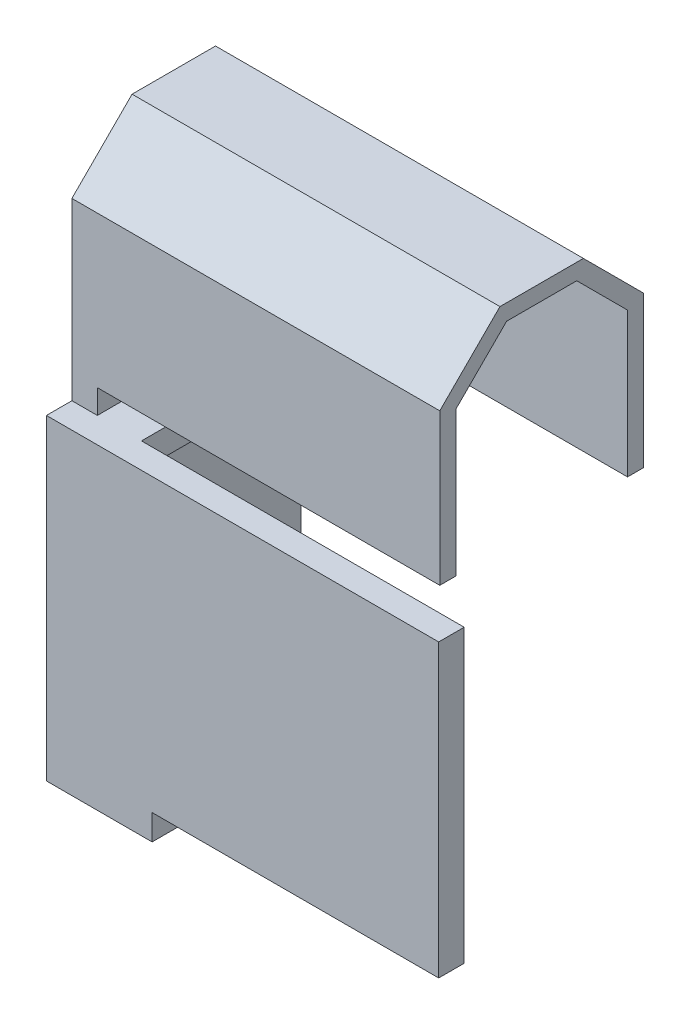
ISO-10303-21;
HEADER;
FILE_DESCRIPTION(('STEP AP214'),'2;1');
FILE_NAME('part.step','',(''),(''),'','','');
FILE_SCHEMA(('AUTOMOTIVE_DESIGN { 1 0 10303 214 1 1 1 1 }'));
ENDSEC;
DATA;
#1=APPLICATION_CONTEXT('core data for automotive mechanical design processes');
#2=APPLICATION_PROTOCOL_DEFINITION('international standard','automotive_design',2000,#1);
#3=PRODUCT_CONTEXT('',#1,'mechanical');
#4=PRODUCT('Part','Part','',(#3));
#5=PRODUCT_RELATED_PRODUCT_CATEGORY('part','',(#4));
#6=PRODUCT_DEFINITION_FORMATION('','',#4);
#7=PRODUCT_DEFINITION_CONTEXT('part definition',#1,'design');
#8=PRODUCT_DEFINITION('design','',#6,#7);
#9=PRODUCT_DEFINITION_SHAPE('','',#8);
#10=(LENGTH_UNIT() NAMED_UNIT(*) SI_UNIT(.MILLI.,.METRE.));
#11=(NAMED_UNIT(*) PLANE_ANGLE_UNIT() SI_UNIT($,.RADIAN.));
#12=(NAMED_UNIT(*) SI_UNIT($,.STERADIAN.) SOLID_ANGLE_UNIT());
#13=UNCERTAINTY_MEASURE_WITH_UNIT(LENGTH_MEASURE(1.E-05),#10,'distance_accuracy_value','');
#14=(GEOMETRIC_REPRESENTATION_CONTEXT(3) GLOBAL_UNCERTAINTY_ASSIGNED_CONTEXT((#13)) GLOBAL_UNIT_ASSIGNED_CONTEXT((#10,
#11,#12)) REPRESENTATION_CONTEXT('',''));
#15=CARTESIAN_POINT('',(0.,0.,0.));
#16=DIRECTION('',(0.,0.,1.));
#17=DIRECTION('',(1.,0.,0.));
#18=AXIS2_PLACEMENT_3D('',#15,#16,#17);
#19=CARTESIAN_POINT('',(3.175,0.,0.));
#20=DIRECTION('',(1.,0.,0.));
#21=DIRECTION('',(0.,0.,-1.));
#22=AXIS2_PLACEMENT_3D('',#19,#20,#21);
#23=PLANE('',#22);
#24=CARTESIAN_POINT('',(3.175,0.,0.));
#25=DIRECTION('',(1.,0.,0.));
#26=DIRECTION('',(0.,0.,-1.));
#27=AXIS2_PLACEMENT_3D('',#24,#25,#26);
#28=CIRCLE('',#27,5.);
#29=CARTESIAN_POINT('',(3.175,0.,-5.));
#30=VERTEX_POINT('',#29);
#31=EDGE_CURVE('E385',#30,#30,#28,.T.);
#32=ORIENTED_EDGE('',*,*,#31,.F.);
#33=EDGE_LOOP('',(#32));
#34=FACE_BOUND('',#33,.T.);
#35=DIRECTION('',(0.,0.707106781186546,-0.707106781186549));
#36=VECTOR('',#35,1.);
#37=CARTESIAN_POINT('',(3.175,10.7,4.37157287525378));
#38=LINE('',#37,#36);
#39=CARTESIAN_POINT('',(3.175,4.37157287525381,10.7));
#40=VERTEX_POINT('',#39);
#41=CARTESIAN_POINT('',(3.175,10.7,4.37157287525378));
#42=VERTEX_POINT('',#41);
#43=EDGE_CURVE('E61',#40,#42,#38,.T.);
#44=ORIENTED_EDGE('',*,*,#43,.F.);
#45=DIRECTION('',(0.,1.,0.));
#46=VECTOR('',#45,1.);
#47=CARTESIAN_POINT('',(3.175,4.37157287525381,10.7));
#48=LINE('',#47,#46);
#49=CARTESIAN_POINT('',(3.175,-13.6385215511798,10.7));
#50=VERTEX_POINT('',#49);
#51=EDGE_CURVE('E289',#50,#40,#48,.T.);
#52=ORIENTED_EDGE('',*,*,#51,.F.);
#53=DIRECTION('',(0.,0.,1.));
#54=VECTOR('',#53,1.);
#55=CARTESIAN_POINT('',(3.175,-13.6385215511798,0.));
#56=LINE('',#55,#54);
#57=CARTESIAN_POINT('',(3.175,-13.6385215511798,-10.7));
#58=VERTEX_POINT('',#57);
#59=EDGE_CURVE('E439',#58,#50,#56,.T.);
#60=ORIENTED_EDGE('',*,*,#59,.F.);
#61=DIRECTION('',(0.,-1.,0.));
#62=VECTOR('',#61,1.);
#63=CARTESIAN_POINT('',(3.175,-11.6385215511798,-10.7));
#64=LINE('',#63,#62);
#65=CARTESIAN_POINT('',(3.175,4.37157287525378,-10.7));
#66=VERTEX_POINT('',#65);
#67=EDGE_CURVE('E294',#66,#58,#64,.T.);
#68=ORIENTED_EDGE('',*,*,#67,.F.);
#69=DIRECTION('',(0.,-0.707106781186549,-0.707106781186546));
#70=VECTOR('',#69,1.);
#71=CARTESIAN_POINT('',(3.175,4.37157287525378,-10.7));
#72=LINE('',#71,#70);
#73=CARTESIAN_POINT('',(3.175,10.7,-4.37157287525381));
#74=VERTEX_POINT('',#73);
#75=EDGE_CURVE('E325',#74,#66,#72,.T.);
#76=ORIENTED_EDGE('',*,*,#75,.F.);
#77=DIRECTION('',(0.,0.,-1.));
#78=VECTOR('',#77,1.);
#79=CARTESIAN_POINT('',(3.175,10.7,-4.37157287525381));
#80=LINE('',#79,#78);
#81=EDGE_CURVE('E66',#42,#74,#80,.T.);
#82=ORIENTED_EDGE('',*,*,#81,.F.);
#83=EDGE_LOOP('',(#44,#52,#60,#68,#76,#82));
#84=FACE_BOUND('',#83,.T.);
#85=ADVANCED_FACE('F43',(#34,#84),#23,.T.);
#86=CARTESIAN_POINT('',(-8.5030184216995,-56.0885215511798,-12.7));
#87=DIRECTION('',(-1.,0.,0.));
#88=DIRECTION('',(0.,0.,1.));
#89=AXIS2_PLACEMENT_3D('',#86,#87,#88);
#90=PLANE('',#89);
#91=DIRECTION('',(0.,0.,1.));
#92=VECTOR('',#91,1.);
#93=CARTESIAN_POINT('',(-8.5030184216995,-52.9135215511798,12.7));
#94=LINE('',#93,#92);
#95=CARTESIAN_POINT('',(-8.5030184216995,-52.9135215511798,-12.7));
#96=VERTEX_POINT('',#95);
#97=CARTESIAN_POINT('',(-8.5030184216995,-52.9135215511798,12.7));
#98=VERTEX_POINT('',#97);
#99=EDGE_CURVE('E347',#96,#98,#94,.T.);
#100=ORIENTED_EDGE('',*,*,#99,.F.);
#101=DIRECTION('',(0.,1.,0.));
#102=VECTOR('',#101,1.);
#103=CARTESIAN_POINT('',(-8.5030184216995,-56.0885215511798,-12.7));
#104=LINE('',#103,#102);
#105=CARTESIAN_POINT('',(-8.5030184216995,-19.8135215511798,-12.7));
#106=VERTEX_POINT('',#105);
#107=EDGE_CURVE('E399',#96,#106,#104,.T.);
#108=ORIENTED_EDGE('',*,*,#107,.T.);
#109=DIRECTION('',(0.,0.,-1.));
#110=VECTOR('',#109,1.);
#111=CARTESIAN_POINT('',(-8.5030184216995,-19.8135215511798,12.7));
#112=LINE('',#111,#110);
#113=CARTESIAN_POINT('',(-8.5030184216995,-19.8135215511798,12.7));
#114=VERTEX_POINT('',#113);
#115=EDGE_CURVE('E363',#114,#106,#112,.T.);
#116=ORIENTED_EDGE('',*,*,#115,.F.);
#117=DIRECTION('',(0.,1.,0.));
#118=VECTOR('',#117,1.);
#119=CARTESIAN_POINT('',(-8.5030184216995,-56.0885215511798,12.7));
#120=LINE('',#119,#118);
#121=EDGE_CURVE('E395',#98,#114,#120,.T.);
#122=ORIENTED_EDGE('',*,*,#121,.F.);
#123=EDGE_LOOP('',(#100,#108,#116,#122));
#124=FACE_BOUND('',#123,.T.);
#125=ADVANCED_FACE('F526',(#124),#90,.F.);
#126=DIRECTION('',(0.,0.,1.));
#127=VECTOR('',#126,1.);
#128=CARTESIAN_POINT('',(-8.5030184216995,-16.6385215511798,12.7));
#129=LINE('',#128,#127);
#130=CARTESIAN_POINT('',(-8.5030184216995,-16.6385215511798,-12.7));
#131=VERTEX_POINT('',#130);
#132=CARTESIAN_POINT('',(-8.5030184216995,-16.6385215511798,12.7));
#133=VERTEX_POINT('',#132);
#134=EDGE_CURVE('E359',#131,#133,#129,.T.);
#135=ORIENTED_EDGE('',*,*,#134,.F.);
#136=CARTESIAN_POINT('',(-8.5030184216995,-13.6385215511798,-12.7));
#137=VERTEX_POINT('',#136);
#138=EDGE_CURVE('E398',#131,#137,#104,.T.);
#139=ORIENTED_EDGE('',*,*,#138,.T.);
#140=DIRECTION('',(0.,0.,1.));
#141=VECTOR('',#140,1.);
#142=CARTESIAN_POINT('',(-8.5030184216995,-13.6385215511798,-12.7));
#143=LINE('',#142,#141);
#144=CARTESIAN_POINT('',(-8.5030184216995,-13.6385215511798,12.7));
#145=VERTEX_POINT('',#144);
#146=EDGE_CURVE('E250',#137,#145,#143,.T.);
#147=ORIENTED_EDGE('',*,*,#146,.T.);
#148=EDGE_CURVE('E392',#133,#145,#120,.T.);
#149=ORIENTED_EDGE('',*,*,#148,.F.);
#150=EDGE_LOOP('',(#135,#139,#147,#149));
#151=FACE_BOUND('',#150,.T.);
#152=ADVANCED_FACE('F532',(#151),#90,.F.);
#153=CARTESIAN_POINT('',(0.,0.,0.));
#154=DIRECTION('',(1.,0.,0.));
#155=DIRECTION('',(0.,0.,-1.));
#156=AXIS2_PLACEMENT_3D('',#153,#154,#155);
#157=PLANE('',#156);
#158=CARTESIAN_POINT('',(0.,0.,0.));
#159=DIRECTION('',(1.,0.,0.));
#160=DIRECTION('',(0.,0.,-1.));
#161=AXIS2_PLACEMENT_3D('',#158,#159,#160);
#162=CIRCLE('',#161,3.);
#163=CARTESIAN_POINT('',(0.,0.,-3.));
#164=VERTEX_POINT('',#163);
#165=EDGE_CURVE('E438',#164,#164,#162,.T.);
#166=ORIENTED_EDGE('',*,*,#165,.T.);
#167=EDGE_LOOP('',(#166));
#168=FACE_BOUND('',#167,.T.);
#169=DIRECTION('',(0.,-1.,0.));
#170=VECTOR('',#169,1.);
#171=CARTESIAN_POINT('',(0.,-11.6385215511798,10.7));
#172=LINE('',#171,#170);
#173=CARTESIAN_POINT('',(0.,3.19999999999994,10.7));
#174=VERTEX_POINT('',#173);
#175=CARTESIAN_POINT('',(0.,-13.6385215511798,10.7));
#176=VERTEX_POINT('',#175);
#177=EDGE_CURVE('E421',#174,#176,#172,.T.);
#178=ORIENTED_EDGE('',*,*,#177,.F.);
#179=DIRECTION('',(0.,-0.707106781186551,0.707106781186544));
#180=VECTOR('',#179,1.);
#181=CARTESIAN_POINT('',(0.,3.19999999999994,10.7));
#182=LINE('',#181,#180);
#183=CARTESIAN_POINT('',(0.,10.7,3.20000000000003));
#184=VERTEX_POINT('',#183);
#185=EDGE_CURVE('E472',#174,#184,#182,.F.);
#186=ORIENTED_EDGE('',*,*,#185,.T.);
#187=DIRECTION('',(0.,0.,1.));
#188=VECTOR('',#187,1.);
#189=CARTESIAN_POINT('',(0.,10.7,10.7));
#190=LINE('',#189,#188);
#191=CARTESIAN_POINT('',(0.,10.7,-3.19999999999994));
#192=VERTEX_POINT('',#191);
#193=EDGE_CURVE('E429',#192,#184,#190,.T.);
#194=ORIENTED_EDGE('',*,*,#193,.F.);
#195=DIRECTION('',(0.,0.707106781186544,0.707106781186551));
#196=VECTOR('',#195,1.);
#197=CARTESIAN_POINT('',(0.,10.7,-3.19999999999994));
#198=LINE('',#197,#196);
#199=CARTESIAN_POINT('',(0.,3.20000000000003,-10.7));
#200=VERTEX_POINT('',#199);
#201=EDGE_CURVE('E470',#192,#200,#198,.F.);
#202=ORIENTED_EDGE('',*,*,#201,.T.);
#203=DIRECTION('',(0.,1.,0.));
#204=VECTOR('',#203,1.);
#205=CARTESIAN_POINT('',(0.,10.7,-10.7));
#206=LINE('',#205,#204);
#207=CARTESIAN_POINT('',(0.,-13.6385215511798,-10.7));
#208=VERTEX_POINT('',#207);
#209=EDGE_CURVE('E414',#208,#200,#206,.T.);
#210=ORIENTED_EDGE('',*,*,#209,.F.);
#211=DIRECTION('',(0.,0.,1.));
#212=VECTOR('',#211,1.);
#213=CARTESIAN_POINT('',(0.,-13.6385215511798,0.));
#214=LINE('',#213,#212);
#215=EDGE_CURVE('E443',#208,#176,#214,.T.);
#216=ORIENTED_EDGE('',*,*,#215,.T.);
#217=EDGE_LOOP('',(#178,#186,#194,#202,#210,#216));
#218=FACE_BOUND('',#217,.T.);
#219=ADVANCED_FACE('F500',(#168,#218),#157,.F.);
#220=CARTESIAN_POINT('',(3.175,0.,-12.7));
#221=DIRECTION('',(0.,0.,-1.));
#222=DIRECTION('',(-1.,0.,0.));
#223=AXIS2_PLACEMENT_3D('',#220,#221,#222);
#224=PLANE('',#223);
#225=DIRECTION('',(0.,-1.,0.));
#226=VECTOR('',#225,1.);
#227=CARTESIAN_POINT('',(-11.675,12.7,-12.7));
#228=LINE('',#227,#226);
#229=CARTESIAN_POINT('',(-11.675,5.19999999999997,-12.7));
#230=VERTEX_POINT('',#229);
#231=CARTESIAN_POINT('',(-11.675,-56.0885215511798,-12.7));
#232=VERTEX_POINT('',#231);
#233=EDGE_CURVE('E245',#230,#232,#228,.T.);
#234=ORIENTED_EDGE('',*,*,#233,.F.);
#235=DIRECTION('',(1.,0.,0.));
#236=VECTOR('',#235,1.);
#237=CARTESIAN_POINT('',(3.175,5.19999999999997,-12.7));
#238=LINE('',#237,#236);
#239=CARTESIAN_POINT('',(34.175,5.19999999999997,-12.7));
#240=VERTEX_POINT('',#239);
#241=EDGE_CURVE('E465',#230,#240,#238,.T.);
#242=ORIENTED_EDGE('',*,*,#241,.T.);
#243=DIRECTION('',(0.,1.,0.));
#244=VECTOR('',#243,1.);
#245=CARTESIAN_POINT('',(34.175,-13.6385215511798,-12.7));
#246=LINE('',#245,#244);
#247=CARTESIAN_POINT('',(34.175,-13.6385215511798,-12.7));
#248=VERTEX_POINT('',#247);
#249=EDGE_CURVE('E318',#248,#240,#246,.T.);
#250=ORIENTED_EDGE('',*,*,#249,.F.);
#251=DIRECTION('',(-1.,0.,0.));
#252=VECTOR('',#251,1.);
#253=CARTESIAN_POINT('',(3.175,-13.6385215511798,-12.7));
#254=LINE('',#253,#252);
#255=EDGE_CURVE('E442',#248,#137,#254,.T.);
#256=ORIENTED_EDGE('',*,*,#255,.T.);
#257=ORIENTED_EDGE('',*,*,#138,.F.);
#258=DIRECTION('',(-1.,0.,0.));
#259=VECTOR('',#258,1.);
#260=CARTESIAN_POINT('',(-3.0030184216995,-16.6385215511798,-12.7));
#261=LINE('',#260,#259);
#262=CARTESIAN_POINT('',(-3.0030184216995,-16.6385215511798,-12.7));
#263=VERTEX_POINT('',#262);
#264=EDGE_CURVE('E369',#263,#131,#261,.T.);
#265=ORIENTED_EDGE('',*,*,#264,.F.);
#266=DIRECTION('',(0.,1.,0.));
#267=VECTOR('',#266,1.);
#268=CARTESIAN_POINT('',(-3.0030184216995,-19.8135215511798,-12.7));
#269=LINE('',#268,#267);
#270=CARTESIAN_POINT('',(-3.0030184216995,-19.8135215511798,-12.7));
#271=VERTEX_POINT('',#270);
#272=EDGE_CURVE('E367',#271,#263,#269,.T.);
#273=ORIENTED_EDGE('',*,*,#272,.F.);
#274=DIRECTION('',(-1.,0.,0.));
#275=VECTOR('',#274,1.);
#276=CARTESIAN_POINT('',(-3.0030184216995,-19.8135215511798,-12.7));
#277=LINE('',#276,#275);
#278=EDGE_CURVE('E376',#271,#106,#277,.T.);
#279=ORIENTED_EDGE('',*,*,#278,.T.);
#280=ORIENTED_EDGE('',*,*,#107,.F.);
#281=DIRECTION('',(-1.,0.,0.));
#282=VECTOR('',#281,1.);
#283=CARTESIAN_POINT('',(1.4969815783005,-52.9135215511798,-12.7));
#284=LINE('',#283,#282);
#285=CARTESIAN_POINT('',(1.4969815783005,-52.9135215511798,-12.7));
#286=VERTEX_POINT('',#285);
#287=EDGE_CURVE('E357',#286,#96,#284,.T.);
#288=ORIENTED_EDGE('',*,*,#287,.F.);
#289=DIRECTION('',(0.,1.,0.));
#290=VECTOR('',#289,1.);
#291=CARTESIAN_POINT('',(1.4969815783005,-56.0885215511798,-12.7));
#292=LINE('',#291,#290);
#293=CARTESIAN_POINT('',(1.4969815783005,-56.0885215511798,-12.7));
#294=VERTEX_POINT('',#293);
#295=EDGE_CURVE('E349',#294,#286,#292,.T.);
#296=ORIENTED_EDGE('',*,*,#295,.F.);
#297=DIRECTION('',(1.,0.,0.));
#298=VECTOR('',#297,1.);
#299=CARTESIAN_POINT('',(-11.675,-56.0885215511798,-12.7));
#300=LINE('',#299,#298);
#301=EDGE_CURVE('E249',#232,#294,#300,.T.);
#302=ORIENTED_EDGE('',*,*,#301,.F.);
#303=EDGE_LOOP('',(#234,#242,#250,#256,#257,#265,#273,#279,#280,#288,#296,#302));
#304=FACE_BOUND('',#303,.T.);
#305=ADVANCED_FACE('F538',(#304),#224,.T.);
#306=CARTESIAN_POINT('',(3.175,12.7,0.));
#307=DIRECTION('',(0.,1.,0.));
#308=DIRECTION('',(0.,0.,1.));
#309=AXIS2_PLACEMENT_3D('',#306,#307,#308);
#310=PLANE('',#309);
#311=DIRECTION('',(0.,0.,-1.));
#312=VECTOR('',#311,1.);
#313=CARTESIAN_POINT('',(-11.675,12.7,12.7));
#314=LINE('',#313,#312);
#315=CARTESIAN_POINT('',(-11.675,12.7,5.19999999999997));
#316=VERTEX_POINT('',#315);
#317=CARTESIAN_POINT('',(-11.675,12.7,-5.2));
#318=VERTEX_POINT('',#317);
#319=EDGE_CURVE('E408',#316,#318,#314,.T.);
#320=ORIENTED_EDGE('',*,*,#319,.F.);
#321=DIRECTION('',(1.,0.,0.));
#322=VECTOR('',#321,1.);
#323=CARTESIAN_POINT('',(3.175,12.7,5.19999999999997));
#324=LINE('',#323,#322);
#325=CARTESIAN_POINT('',(34.175,12.7,5.19999999999997));
#326=VERTEX_POINT('',#325);
#327=EDGE_CURVE('E463',#316,#326,#324,.T.);
#328=ORIENTED_EDGE('',*,*,#327,.T.);
#329=DIRECTION('',(0.,0.,1.));
#330=VECTOR('',#329,1.);
#331=CARTESIAN_POINT('',(34.175,12.7,-5.2));
#332=LINE('',#331,#330);
#333=CARTESIAN_POINT('',(34.175,12.7,-5.2));
#334=VERTEX_POINT('',#333);
#335=EDGE_CURVE('E293',#334,#326,#332,.T.);
#336=ORIENTED_EDGE('',*,*,#335,.F.);
#337=DIRECTION('',(-1.,0.,0.));
#338=VECTOR('',#337,1.);
#339=CARTESIAN_POINT('',(3.175,12.7,-5.2));
#340=LINE('',#339,#338);
#341=EDGE_CURVE('E460',#334,#318,#340,.T.);
#342=ORIENTED_EDGE('',*,*,#341,.T.);
#343=EDGE_LOOP('',(#320,#328,#336,#342));
#344=FACE_BOUND('',#343,.T.);
#345=ADVANCED_FACE('F544',(#344),#310,.T.);
#346=CARTESIAN_POINT('',(3.175,0.,12.7));
#347=DIRECTION('',(0.,0.,1.));
#348=DIRECTION('',(1.,0.,0.));
#349=AXIS2_PLACEMENT_3D('',#346,#347,#348);
#350=PLANE('',#349);
#351=DIRECTION('',(-1.,0.,0.));
#352=VECTOR('',#351,1.);
#353=CARTESIAN_POINT('',(-11.675,-16.6385215511798,12.7));
#354=LINE('',#353,#352);
#355=CARTESIAN_POINT('',(-11.675,-16.6385215511798,12.7));
#356=VERTEX_POINT('',#355);
#357=EDGE_CURVE('E11',#133,#356,#354,.T.);
#358=ORIENTED_EDGE('',*,*,#357,.F.);
#359=ORIENTED_EDGE('',*,*,#148,.T.);
#360=DIRECTION('',(-1.,0.,0.));
#361=VECTOR('',#360,1.);
#362=CARTESIAN_POINT('',(3.175,-13.6385215511798,12.7));
#363=LINE('',#362,#361);
#364=CARTESIAN_POINT('',(34.175,-13.6385215511798,12.7));
#365=VERTEX_POINT('',#364);
#366=EDGE_CURVE('E450',#365,#145,#363,.T.);
#367=ORIENTED_EDGE('',*,*,#366,.F.);
#368=DIRECTION('',(0.,-1.,0.));
#369=VECTOR('',#368,1.);
#370=CARTESIAN_POINT('',(34.175,5.2,12.7));
#371=LINE('',#370,#369);
#372=CARTESIAN_POINT('',(34.175,5.2,12.7));
#373=VERTEX_POINT('',#372);
#374=EDGE_CURVE('E300',#373,#365,#371,.T.);
#375=ORIENTED_EDGE('',*,*,#374,.F.);
#376=DIRECTION('',(-1.,0.,0.));
#377=VECTOR('',#376,1.);
#378=CARTESIAN_POINT('',(3.175,5.2,12.7));
#379=LINE('',#378,#377);
#380=CARTESIAN_POINT('',(-11.675,5.19999999999999,12.7));
#381=VERTEX_POINT('',#380);
#382=EDGE_CURVE('E453',#373,#381,#379,.T.);
#383=ORIENTED_EDGE('',*,*,#382,.T.);
#384=DIRECTION('',(0.,1.,0.));
#385=VECTOR('',#384,1.);
#386=CARTESIAN_POINT('',(-11.675,-13.6385215511798,12.7));
#387=LINE('',#386,#385);
#388=EDGE_CURVE('E412',#356,#381,#387,.T.);
#389=ORIENTED_EDGE('',*,*,#388,.F.);
#390=EDGE_LOOP('',(#358,#359,#367,#375,#383,#389));
#391=FACE_BOUND('',#390,.T.);
#392=ADVANCED_FACE('F519',(#391),#350,.T.);
#393=CARTESIAN_POINT('',(3.175,0.,0.));
#394=DIRECTION('',(-1.,0.,0.));
#395=DIRECTION('',(0.,0.,1.));
#396=AXIS2_PLACEMENT_3D('',#393,#394,#395);
#397=CYLINDRICAL_SURFACE('',#396,3.);
#398=ORIENTED_EDGE('',*,*,#165,.F.);
#399=EDGE_LOOP('',(#398));
#400=FACE_BOUND('',#399,.T.);
#401=CARTESIAN_POINT('',(8.175,0.,0.));
#402=DIRECTION('',(1.,0.,0.));
#403=DIRECTION('',(0.,0.,-1.));
#404=AXIS2_PLACEMENT_3D('',#401,#402,#403);
#405=CIRCLE('',#404,3.);
#406=CARTESIAN_POINT('',(8.175,0.,-3.));
#407=VERTEX_POINT('',#406);
#408=EDGE_CURVE('E382',#407,#407,#405,.T.);
#409=ORIENTED_EDGE('',*,*,#408,.T.);
#410=EDGE_LOOP('',(#409));
#411=FACE_BOUND('',#410,.T.);
#412=ADVANCED_FACE('F511',(#400,#411),#397,.F.);
#413=CARTESIAN_POINT('',(3.175,-13.6385215511798,0.));
#414=DIRECTION('',(0.,-1.,0.));
#415=DIRECTION('',(0.,0.,-1.));
#416=AXIS2_PLACEMENT_3D('',#413,#414,#415);
#417=PLANE('',#416);
#418=ORIENTED_EDGE('',*,*,#146,.F.);
#419=ORIENTED_EDGE('',*,*,#255,.F.);
#420=DIRECTION('',(0.,0.,-1.));
#421=VECTOR('',#420,1.);
#422=CARTESIAN_POINT('',(34.175,-13.6385215511798,-10.7));
#423=LINE('',#422,#421);
#424=CARTESIAN_POINT('',(34.175,-13.6385215511798,-10.7));
#425=VERTEX_POINT('',#424);
#426=EDGE_CURVE('E315',#425,#248,#423,.T.);
#427=ORIENTED_EDGE('',*,*,#426,.F.);
#428=DIRECTION('',(-1.,0.,0.));
#429=VECTOR('',#428,1.);
#430=CARTESIAN_POINT('',(34.175,-13.6385215511798,-10.7));
#431=LINE('',#430,#429);
#432=EDGE_CURVE('E321',#425,#58,#431,.T.);
#433=ORIENTED_EDGE('',*,*,#432,.T.);
#434=ORIENTED_EDGE('',*,*,#59,.T.);
#435=DIRECTION('',(-1.,0.,0.));
#436=VECTOR('',#435,1.);
#437=CARTESIAN_POINT('',(34.175,-13.6385215511798,10.7));
#438=LINE('',#437,#436);
#439=CARTESIAN_POINT('',(34.175,-13.6385215511798,10.7));
#440=VERTEX_POINT('',#439);
#441=EDGE_CURVE('E344',#440,#50,#438,.T.);
#442=ORIENTED_EDGE('',*,*,#441,.F.);
#443=DIRECTION('',(0.,0.,-1.));
#444=VECTOR('',#443,1.);
#445=CARTESIAN_POINT('',(34.175,-13.6385215511798,10.7));
#446=LINE('',#445,#444);
#447=EDGE_CURVE('E303',#365,#440,#446,.T.);
#448=ORIENTED_EDGE('',*,*,#447,.F.);
#449=ORIENTED_EDGE('',*,*,#366,.T.);
#450=EDGE_LOOP('',(#418,#419,#427,#433,#434,#442,#448,#449));
#451=FACE_BOUND('',#450,.T.);
#452=DIRECTION('',(1.,0.,0.));
#453=VECTOR('',#452,1.);
#454=CARTESIAN_POINT('',(-8.5,-13.6385215511798,-10.7));
#455=LINE('',#454,#453);
#456=CARTESIAN_POINT('',(-8.5,-13.6385215511798,-10.7));
#457=VERTEX_POINT('',#456);
#458=EDGE_CURVE('E435',#457,#208,#455,.T.);
#459=ORIENTED_EDGE('',*,*,#458,.F.);
#460=DIRECTION('',(0.,0.,1.));
#461=VECTOR('',#460,1.);
#462=CARTESIAN_POINT('',(-8.5,-13.6385215511798,10.7));
#463=LINE('',#462,#461);
#464=CARTESIAN_POINT('',(-8.5,-13.6385215511798,10.7));
#465=VERTEX_POINT('',#464);
#466=EDGE_CURVE('E405',#457,#465,#463,.T.);
#467=ORIENTED_EDGE('',*,*,#466,.T.);
#468=DIRECTION('',(1.,0.,0.));
#469=VECTOR('',#468,1.);
#470=CARTESIAN_POINT('',(-8.5,-13.6385215511798,10.7));
#471=LINE('',#470,#469);
#472=EDGE_CURVE('E426',#465,#176,#471,.T.);
#473=ORIENTED_EDGE('',*,*,#472,.T.);
#474=ORIENTED_EDGE('',*,*,#215,.F.);
#475=EDGE_LOOP('',(#459,#467,#473,#474));
#476=FACE_BOUND('',#475,.T.);
#477=ADVANCED_FACE('F509',(#451,#476),#417,.T.);
#478=CARTESIAN_POINT('',(-8.5,10.7,-10.7));
#479=DIRECTION('',(0.,0.,-1.));
#480=DIRECTION('',(-1.,0.,0.));
#481=AXIS2_PLACEMENT_3D('',#478,#479,#480);
#482=PLANE('',#481);
#483=ORIENTED_EDGE('',*,*,#209,.T.);
#484=DIRECTION('',(-1.,0.,0.));
#485=VECTOR('',#484,1.);
#486=CARTESIAN_POINT('',(-8.5,3.20000000000003,-10.7));
#487=LINE('',#486,#485);
#488=CARTESIAN_POINT('',(-8.5,3.20000000000003,-10.7));
#489=VERTEX_POINT('',#488);
#490=EDGE_CURVE('E48',#200,#489,#487,.T.);
#491=ORIENTED_EDGE('',*,*,#490,.T.);
#492=DIRECTION('',(0.,1.,0.));
#493=VECTOR('',#492,1.);
#494=CARTESIAN_POINT('',(-8.5,-11.6385215511798,-10.7));
#495=LINE('',#494,#493);
#496=EDGE_CURVE('E417',#457,#489,#495,.T.);
#497=ORIENTED_EDGE('',*,*,#496,.F.);
#498=ORIENTED_EDGE('',*,*,#458,.T.);
#499=EDGE_LOOP('',(#483,#491,#497,#498));
#500=FACE_BOUND('',#499,.T.);
#501=ADVANCED_FACE('F487',(#500),#482,.F.);
#502=CARTESIAN_POINT('',(-8.5,10.7,10.7));
#503=DIRECTION('',(0.,1.,0.));
#504=DIRECTION('',(0.,0.,1.));
#505=AXIS2_PLACEMENT_3D('',#502,#503,#504);
#506=PLANE('',#505);
#507=ORIENTED_EDGE('',*,*,#193,.T.);
#508=DIRECTION('',(-1.,0.,0.));
#509=VECTOR('',#508,1.);
#510=CARTESIAN_POINT('',(-8.5,10.7,3.20000000000003));
#511=LINE('',#510,#509);
#512=CARTESIAN_POINT('',(-8.5,10.7,3.20000000000003));
#513=VERTEX_POINT('',#512);
#514=EDGE_CURVE('E477',#184,#513,#511,.T.);
#515=ORIENTED_EDGE('',*,*,#514,.T.);
#516=DIRECTION('',(0.,0.,1.));
#517=VECTOR('',#516,1.);
#518=CARTESIAN_POINT('',(-8.5,10.7,10.7));
#519=LINE('',#518,#517);
#520=CARTESIAN_POINT('',(-8.5,10.7,-3.19999999999994));
#521=VERTEX_POINT('',#520);
#522=EDGE_CURVE('E420',#521,#513,#519,.T.);
#523=ORIENTED_EDGE('',*,*,#522,.F.);
#524=DIRECTION('',(1.,0.,0.));
#525=VECTOR('',#524,1.);
#526=CARTESIAN_POINT('',(0.,10.7,-3.19999999999994));
#527=LINE('',#526,#525);
#528=EDGE_CURVE('E474',#521,#192,#527,.T.);
#529=ORIENTED_EDGE('',*,*,#528,.T.);
#530=EDGE_LOOP('',(#507,#515,#523,#529));
#531=FACE_BOUND('',#530,.T.);
#532=ADVANCED_FACE('F496',(#531),#506,.F.);
#533=CARTESIAN_POINT('',(-8.5,-11.6385215511798,10.7));
#534=DIRECTION('',(0.,0.,1.));
#535=DIRECTION('',(0.,-1.,0.));
#536=AXIS2_PLACEMENT_3D('',#533,#534,#535);
#537=PLANE('',#536);
#538=DIRECTION('',(0.,-1.,0.));
#539=VECTOR('',#538,1.);
#540=CARTESIAN_POINT('',(-8.5,-11.6385215511798,10.7));
#541=LINE('',#540,#539);
#542=CARTESIAN_POINT('',(-8.5,3.19999999999993,10.7));
#543=VERTEX_POINT('',#542);
#544=EDGE_CURVE('E424',#543,#465,#541,.T.);
#545=ORIENTED_EDGE('',*,*,#544,.F.);
#546=DIRECTION('',(1.,0.,0.));
#547=VECTOR('',#546,1.);
#548=CARTESIAN_POINT('',(0.,3.19999999999994,10.7));
#549=LINE('',#548,#547);
#550=EDGE_CURVE('E467',#543,#174,#549,.T.);
#551=ORIENTED_EDGE('',*,*,#550,.T.);
#552=ORIENTED_EDGE('',*,*,#177,.T.);
#553=ORIENTED_EDGE('',*,*,#472,.F.);
#554=EDGE_LOOP('',(#545,#551,#552,#553));
#555=FACE_BOUND('',#554,.T.);
#556=ADVANCED_FACE('F505',(#555),#537,.F.);
#557=CARTESIAN_POINT('',(-8.5,0.,0.));
#558=DIRECTION('',(-1.,0.,0.));
#559=DIRECTION('',(0.,0.,1.));
#560=AXIS2_PLACEMENT_3D('',#557,#558,#559);
#561=PLANE('',#560);
#562=CARTESIAN_POINT('',(-8.5,0.,0.));
#563=DIRECTION('',(-1.,0.,0.));
#564=DIRECTION('',(0.,0.,1.));
#565=AXIS2_PLACEMENT_3D('',#562,#563,#564);
#566=CIRCLE('',#565,7.);
#567=CARTESIAN_POINT('',(-8.5,0.,7.));
#568=VERTEX_POINT('',#567);
#569=EDGE_CURVE('E401',#568,#568,#566,.T.);
#570=ORIENTED_EDGE('',*,*,#569,.T.);
#571=EDGE_LOOP('',(#570));
#572=FACE_BOUND('',#571,.T.);
#573=ORIENTED_EDGE('',*,*,#522,.T.);
#574=DIRECTION('',(0.,0.707106781186551,-0.707106781186544));
#575=VECTOR('',#574,1.);
#576=CARTESIAN_POINT('',(-8.5,3.19999999999994,10.7));
#577=LINE('',#576,#575);
#578=EDGE_CURVE('E480',#513,#543,#577,.F.);
#579=ORIENTED_EDGE('',*,*,#578,.T.);
#580=ORIENTED_EDGE('',*,*,#544,.T.);
#581=ORIENTED_EDGE('',*,*,#466,.F.);
#582=ORIENTED_EDGE('',*,*,#496,.T.);
#583=DIRECTION('',(0.,-0.707106781186544,-0.707106781186551));
#584=VECTOR('',#583,1.);
#585=CARTESIAN_POINT('',(-8.5,10.7,-3.19999999999994));
#586=LINE('',#585,#584);
#587=EDGE_CURVE('E479',#489,#521,#586,.F.);
#588=ORIENTED_EDGE('',*,*,#587,.T.);
#589=EDGE_LOOP('',(#573,#579,#580,#581,#582,#588));
#590=FACE_BOUND('',#589,.T.);
#591=ADVANCED_FACE('F491',(#572,#590),#561,.F.);
#592=CARTESIAN_POINT('',(-11.675,0.,0.));
#593=DIRECTION('',(-1.,0.,0.));
#594=DIRECTION('',(0.,0.,1.));
#595=AXIS2_PLACEMENT_3D('',#592,#593,#594);
#596=PLANE('',#595);
#597=DIRECTION('',(0.,0.,-1.));
#598=VECTOR('',#597,1.);
#599=CARTESIAN_POINT('',(-11.675,-56.0885215511798,-12.7));
#600=LINE('',#599,#598);
#601=CARTESIAN_POINT('',(-11.675,-56.0885215511798,15.875));
#602=VERTEX_POINT('',#601);
#603=EDGE_CURVE('E238',#602,#232,#600,.T.);
#604=ORIENTED_EDGE('',*,*,#603,.F.);
#605=DIRECTION('',(0.,-1.,0.));
#606=VECTOR('',#605,1.);
#607=CARTESIAN_POINT('',(-11.675,-16.6385215511798,15.875));
#608=LINE('',#607,#606);
#609=CARTESIAN_POINT('',(-11.675,-16.6385215511798,15.875));
#610=VERTEX_POINT('',#609);
#611=EDGE_CURVE('E243',#610,#602,#608,.T.);
#612=ORIENTED_EDGE('',*,*,#611,.F.);
#613=DIRECTION('',(0.,0.,-1.));
#614=VECTOR('',#613,1.);
#615=CARTESIAN_POINT('',(-11.675,-16.6385215511798,15.875));
#616=LINE('',#615,#614);
#617=EDGE_CURVE('E273',#610,#356,#616,.T.);
#618=ORIENTED_EDGE('',*,*,#617,.T.);
#619=ORIENTED_EDGE('',*,*,#388,.T.);
#620=DIRECTION('',(0.,-0.707106781186546,0.707106781186549));
#621=VECTOR('',#620,1.);
#622=CARTESIAN_POINT('',(-11.675,8.95000000000001,8.94999999999998));
#623=LINE('',#622,#621);
#624=EDGE_CURVE('E458',#381,#316,#623,.F.);
#625=ORIENTED_EDGE('',*,*,#624,.T.);
#626=ORIENTED_EDGE('',*,*,#319,.T.);
#627=DIRECTION('',(0.,0.707106781186549,0.707106781186546));
#628=VECTOR('',#627,1.);
#629=CARTESIAN_POINT('',(-11.675,8.94999999999998,-8.95000000000001));
#630=LINE('',#629,#628);
#631=EDGE_CURVE('E456',#318,#230,#630,.F.);
#632=ORIENTED_EDGE('',*,*,#631,.T.);
#633=ORIENTED_EDGE('',*,*,#233,.T.);
#634=EDGE_LOOP('',(#604,#612,#618,#619,#625,#626,#632,#633));
#635=FACE_BOUND('',#634,.T.);
#636=CARTESIAN_POINT('',(-11.675,0.,0.));
#637=DIRECTION('',(-1.,0.,0.));
#638=DIRECTION('',(0.,0.,1.));
#639=AXIS2_PLACEMENT_3D('',#636,#637,#638);
#640=CIRCLE('',#639,7.);
#641=CARTESIAN_POINT('',(-11.675,0.,7.));
#642=VERTEX_POINT('',#641);
#643=EDGE_CURVE('E402',#642,#642,#640,.T.);
#644=ORIENTED_EDGE('',*,*,#643,.F.);
#645=EDGE_LOOP('',(#644));
#646=FACE_BOUND('',#645,.T.);
#647=ADVANCED_FACE('F240',(#635,#646),#596,.T.);
#648=CARTESIAN_POINT('',(-11.675,0.,0.));
#649=DIRECTION('',(1.,0.,0.));
#650=DIRECTION('',(0.,0.,-1.));
#651=AXIS2_PLACEMENT_3D('',#648,#649,#650);
#652=CYLINDRICAL_SURFACE('',#651,7.);
#653=ORIENTED_EDGE('',*,*,#643,.T.);
#654=EDGE_LOOP('',(#653));
#655=FACE_BOUND('',#654,.T.);
#656=ORIENTED_EDGE('',*,*,#569,.F.);
#657=EDGE_LOOP('',(#656));
#658=FACE_BOUND('',#657,.T.);
#659=ADVANCED_FACE('F564',(#655,#658),#652,.F.);
#660=CARTESIAN_POINT('',(0.,-56.0885215511798,0.));
#661=DIRECTION('',(0.,1.,0.));
#662=DIRECTION('',(0.,0.,1.));
#663=AXIS2_PLACEMENT_3D('',#660,#661,#662);
#664=PLANE('',#663);
#665=ORIENTED_EDGE('',*,*,#603,.T.);
#666=ORIENTED_EDGE('',*,*,#301,.T.);
#667=DIRECTION('',(0.,0.,-1.));
#668=VECTOR('',#667,1.);
#669=CARTESIAN_POINT('',(1.4969815783005,-56.0885215511798,12.7));
#670=LINE('',#669,#668);
#671=CARTESIAN_POINT('',(1.4969815783005,-56.0885215511798,15.875));
#672=VERTEX_POINT('',#671);
#673=EDGE_CURVE('E263',#672,#294,#670,.T.);
#674=ORIENTED_EDGE('',*,*,#673,.F.);
#675=DIRECTION('',(1.,0.,0.));
#676=VECTOR('',#675,1.);
#677=CARTESIAN_POINT('',(-11.675,-56.0885215511798,15.875));
#678=LINE('',#677,#676);
#679=EDGE_CURVE('E255',#602,#672,#678,.T.);
#680=ORIENTED_EDGE('',*,*,#679,.F.);
#681=EDGE_LOOP('',(#665,#666,#674,#680));
#682=FACE_BOUND('',#681,.T.);
#683=ADVANCED_FACE('F261',(#682),#664,.F.);
#684=CARTESIAN_POINT('',(8.175,0.,0.));
#685=DIRECTION('',(1.,0.,0.));
#686=DIRECTION('',(0.,0.,-1.));
#687=AXIS2_PLACEMENT_3D('',#684,#685,#686);
#688=PLANE('',#687);
#689=CARTESIAN_POINT('',(8.175,0.,0.));
#690=DIRECTION('',(1.,0.,0.));
#691=DIRECTION('',(0.,0.,-1.));
#692=AXIS2_PLACEMENT_3D('',#689,#690,#691);
#693=CIRCLE('',#692,5.);
#694=CARTESIAN_POINT('',(8.175,0.,-5.));
#695=VERTEX_POINT('',#694);
#696=EDGE_CURVE('E386',#695,#695,#693,.T.);
#697=ORIENTED_EDGE('',*,*,#696,.T.);
#698=EDGE_LOOP('',(#697));
#699=FACE_BOUND('',#698,.T.);
#700=ORIENTED_EDGE('',*,*,#408,.F.);
#701=EDGE_LOOP('',(#700));
#702=FACE_BOUND('',#701,.T.);
#703=ADVANCED_FACE('F552',(#699,#702),#688,.T.);
#704=CARTESIAN_POINT('',(8.175,0.,0.));
#705=DIRECTION('',(-1.,0.,0.));
#706=DIRECTION('',(0.,0.,1.));
#707=AXIS2_PLACEMENT_3D('',#704,#705,#706);
#708=CYLINDRICAL_SURFACE('',#707,5.);
#709=ORIENTED_EDGE('',*,*,#696,.F.);
#710=EDGE_LOOP('',(#709));
#711=FACE_BOUND('',#710,.T.);
#712=ORIENTED_EDGE('',*,*,#31,.T.);
#713=EDGE_LOOP('',(#712));
#714=FACE_BOUND('',#713,.T.);
#715=ADVANCED_FACE('F554',(#711,#714),#708,.T.);
#716=CARTESIAN_POINT('',(3.175,5.2,12.7));
#717=DIRECTION('',(0.,-0.707106781186549,-0.707106781186546));
#718=DIRECTION('',(-1.,0.,0.));
#719=AXIS2_PLACEMENT_3D('',#716,#717,#718);
#720=PLANE('',#719);
#721=ORIENTED_EDGE('',*,*,#382,.F.);
#722=DIRECTION('',(0.,-0.707106781186546,0.707106781186549));
#723=VECTOR('',#722,1.);
#724=CARTESIAN_POINT('',(34.175,12.7,5.19999999999997));
#725=LINE('',#724,#723);
#726=EDGE_CURVE('E297',#326,#373,#725,.T.);
#727=ORIENTED_EDGE('',*,*,#726,.F.);
#728=ORIENTED_EDGE('',*,*,#327,.F.);
#729=ORIENTED_EDGE('',*,*,#624,.F.);
#730=EDGE_LOOP('',(#721,#727,#728,#729));
#731=FACE_BOUND('',#730,.T.);
#732=ADVANCED_FACE('F561',(#731),#720,.F.);
#733=CARTESIAN_POINT('',(3.175,12.7,-5.2));
#734=DIRECTION('',(0.,-0.707106781186546,0.707106781186549));
#735=DIRECTION('',(-1.,0.,0.));
#736=AXIS2_PLACEMENT_3D('',#733,#734,#735);
#737=PLANE('',#736);
#738=ORIENTED_EDGE('',*,*,#341,.F.);
#739=DIRECTION('',(0.,0.707106781186549,0.707106781186546));
#740=VECTOR('',#739,1.);
#741=CARTESIAN_POINT('',(34.175,5.19999999999997,-12.7));
#742=LINE('',#741,#740);
#743=EDGE_CURVE('E290',#240,#334,#742,.T.);
#744=ORIENTED_EDGE('',*,*,#743,.F.);
#745=ORIENTED_EDGE('',*,*,#241,.F.);
#746=ORIENTED_EDGE('',*,*,#631,.F.);
#747=EDGE_LOOP('',(#738,#744,#745,#746));
#748=FACE_BOUND('',#747,.T.);
#749=ADVANCED_FACE('F626',(#748),#737,.F.);
#750=CARTESIAN_POINT('',(-8.5,3.19999999999994,10.7));
#751=DIRECTION('',(0.,-0.707106781186544,-0.707106781186551));
#752=DIRECTION('',(-1.,0.,0.));
#753=AXIS2_PLACEMENT_3D('',#750,#751,#752);
#754=PLANE('',#753);
#755=ORIENTED_EDGE('',*,*,#578,.F.);
#756=ORIENTED_EDGE('',*,*,#514,.F.);
#757=ORIENTED_EDGE('',*,*,#185,.F.);
#758=ORIENTED_EDGE('',*,*,#550,.F.);
#759=EDGE_LOOP('',(#755,#756,#757,#758));
#760=FACE_BOUND('',#759,.T.);
#761=ADVANCED_FACE('F503',(#760),#754,.T.);
#762=CARTESIAN_POINT('',(-8.5,10.7,-3.19999999999994));
#763=DIRECTION('',(0.,-0.707106781186551,0.707106781186544));
#764=DIRECTION('',(-1.,0.,0.));
#765=AXIS2_PLACEMENT_3D('',#762,#763,#764);
#766=PLANE('',#765);
#767=ORIENTED_EDGE('',*,*,#587,.F.);
#768=ORIENTED_EDGE('',*,*,#490,.F.);
#769=ORIENTED_EDGE('',*,*,#201,.F.);
#770=ORIENTED_EDGE('',*,*,#528,.F.);
#771=EDGE_LOOP('',(#767,#768,#769,#770));
#772=FACE_BOUND('',#771,.T.);
#773=ADVANCED_FACE('F46',(#772),#766,.T.);
#774=CARTESIAN_POINT('',(-3.0030184216995,-16.6385215511798,12.7));
#775=DIRECTION('',(0.,-1.,0.));
#776=DIRECTION('',(0.,0.,-1.));
#777=AXIS2_PLACEMENT_3D('',#774,#775,#776);
#778=PLANE('',#777);
#779=ORIENTED_EDGE('',*,*,#134,.T.);
#780=ORIENTED_EDGE('',*,*,#357,.T.);
#781=ORIENTED_EDGE('',*,*,#617,.F.);
#782=DIRECTION('',(-1.,0.,0.));
#783=VECTOR('',#782,1.);
#784=CARTESIAN_POINT('',(-11.675,-16.6385215511798,15.875));
#785=LINE('',#784,#783);
#786=CARTESIAN_POINT('',(37.215,-16.6385215511798,15.875));
#787=VERTEX_POINT('',#786);
#788=EDGE_CURVE('E258',#787,#610,#785,.T.);
#789=ORIENTED_EDGE('',*,*,#788,.F.);
#790=DIRECTION('',(0.,0.,-1.));
#791=VECTOR('',#790,1.);
#792=CARTESIAN_POINT('',(37.215,-16.6385215511798,15.875));
#793=LINE('',#792,#791);
#794=CARTESIAN_POINT('',(37.215,-16.6385215511798,12.7));
#795=VERTEX_POINT('',#794);
#796=EDGE_CURVE('E280',#787,#795,#793,.T.);
#797=ORIENTED_EDGE('',*,*,#796,.T.);
#798=CARTESIAN_POINT('',(-3.0030184216995,-16.6385215511798,12.7));
#799=VERTEX_POINT('',#798);
#800=EDGE_CURVE('E54',#795,#799,#354,.T.);
#801=ORIENTED_EDGE('',*,*,#800,.T.);
#802=DIRECTION('',(0.,0.,1.));
#803=VECTOR('',#802,1.);
#804=CARTESIAN_POINT('',(-3.0030184216995,-16.6385215511798,12.7));
#805=LINE('',#804,#803);
#806=EDGE_CURVE('E360',#263,#799,#805,.T.);
#807=ORIENTED_EDGE('',*,*,#806,.F.);
#808=ORIENTED_EDGE('',*,*,#264,.T.);
#809=EDGE_LOOP('',(#779,#780,#781,#789,#797,#801,#807,#808));
#810=FACE_BOUND('',#809,.T.);
#811=ADVANCED_FACE('F567',(#810),#778,.F.);
#812=CARTESIAN_POINT('',(-3.0030184216995,-19.8135215511798,12.7));
#813=DIRECTION('',(0.,1.,0.));
#814=DIRECTION('',(0.,0.,1.));
#815=AXIS2_PLACEMENT_3D('',#812,#813,#814);
#816=PLANE('',#815);
#817=ORIENTED_EDGE('',*,*,#115,.T.);
#818=ORIENTED_EDGE('',*,*,#278,.F.);
#819=DIRECTION('',(0.,0.,-1.));
#820=VECTOR('',#819,1.);
#821=CARTESIAN_POINT('',(-3.0030184216995,-19.8135215511798,12.7));
#822=LINE('',#821,#820);
#823=CARTESIAN_POINT('',(-3.0030184216995,-19.8135215511798,12.7));
#824=VERTEX_POINT('',#823);
#825=EDGE_CURVE('E365',#824,#271,#822,.T.);
#826=ORIENTED_EDGE('',*,*,#825,.F.);
#827=DIRECTION('',(-1.,0.,0.));
#828=VECTOR('',#827,1.);
#829=CARTESIAN_POINT('',(-3.0030184216995,-19.8135215511798,12.7));
#830=LINE('',#829,#828);
#831=EDGE_CURVE('E379',#824,#114,#830,.T.);
#832=ORIENTED_EDGE('',*,*,#831,.T.);
#833=EDGE_LOOP('',(#817,#818,#826,#832));
#834=FACE_BOUND('',#833,.T.);
#835=ADVANCED_FACE('F661',(#834),#816,.F.);
#836=CARTESIAN_POINT('',(-3.0030184216995,0.,0.));
#837=DIRECTION('',(1.,0.,0.));
#838=DIRECTION('',(0.,0.,-1.));
#839=AXIS2_PLACEMENT_3D('',#836,#837,#838);
#840=PLANE('',#839);
#841=ORIENTED_EDGE('',*,*,#806,.T.);
#842=DIRECTION('',(0.,-1.,0.));
#843=VECTOR('',#842,1.);
#844=CARTESIAN_POINT('',(-3.0030184216995,-19.8135215511798,12.7));
#845=LINE('',#844,#843);
#846=EDGE_CURVE('E362',#799,#824,#845,.T.);
#847=ORIENTED_EDGE('',*,*,#846,.T.);
#848=ORIENTED_EDGE('',*,*,#825,.T.);
#849=ORIENTED_EDGE('',*,*,#272,.T.);
#850=EDGE_LOOP('',(#841,#847,#848,#849));
#851=FACE_BOUND('',#850,.T.);
#852=ADVANCED_FACE('F670',(#851),#840,.T.);
#853=CARTESIAN_POINT('',(1.4969815783005,-52.9135215511798,12.7));
#854=DIRECTION('',(0.,-1.,0.));
#855=DIRECTION('',(0.,0.,-1.));
#856=AXIS2_PLACEMENT_3D('',#853,#854,#855);
#857=PLANE('',#856);
#858=ORIENTED_EDGE('',*,*,#99,.T.);
#859=DIRECTION('',(-1.,0.,0.));
#860=VECTOR('',#859,1.);
#861=CARTESIAN_POINT('',(1.4969815783005,-52.9135215511798,12.7));
#862=LINE('',#861,#860);
#863=CARTESIAN_POINT('',(1.4969815783005,-52.9135215511798,12.7));
#864=VERTEX_POINT('',#863);
#865=EDGE_CURVE('E353',#864,#98,#862,.T.);
#866=ORIENTED_EDGE('',*,*,#865,.F.);
#867=DIRECTION('',(0.,0.,1.));
#868=VECTOR('',#867,1.);
#869=CARTESIAN_POINT('',(1.4969815783005,-52.9135215511798,12.7));
#870=LINE('',#869,#868);
#871=EDGE_CURVE('E351',#286,#864,#870,.T.);
#872=ORIENTED_EDGE('',*,*,#871,.F.);
#873=ORIENTED_EDGE('',*,*,#287,.T.);
#874=EDGE_LOOP('',(#858,#866,#872,#873));
#875=FACE_BOUND('',#874,.T.);
#876=ADVANCED_FACE('F679',(#875),#857,.F.);
#877=CARTESIAN_POINT('',(1.4969815783005,0.,0.));
#878=DIRECTION('',(-1.,0.,0.));
#879=DIRECTION('',(0.,0.,1.));
#880=AXIS2_PLACEMENT_3D('',#877,#878,#879);
#881=PLANE('',#880);
#882=ORIENTED_EDGE('',*,*,#871,.T.);
#883=DIRECTION('',(0.,0.,-1.));
#884=VECTOR('',#883,1.);
#885=CARTESIAN_POINT('',(1.4969815783005,-52.9135215511798,15.875));
#886=LINE('',#885,#884);
#887=CARTESIAN_POINT('',(1.4969815783005,-52.9135215511798,15.875));
#888=VERTEX_POINT('',#887);
#889=EDGE_CURVE('E286',#888,#864,#886,.T.);
#890=ORIENTED_EDGE('',*,*,#889,.F.);
#891=DIRECTION('',(0.,1.,0.));
#892=VECTOR('',#891,1.);
#893=CARTESIAN_POINT('',(1.4969815783005,-56.0885215511798,15.875));
#894=LINE('',#893,#892);
#895=EDGE_CURVE('E264',#672,#888,#894,.T.);
#896=ORIENTED_EDGE('',*,*,#895,.F.);
#897=ORIENTED_EDGE('',*,*,#673,.T.);
#898=ORIENTED_EDGE('',*,*,#295,.T.);
#899=EDGE_LOOP('',(#882,#890,#896,#897,#898));
#900=FACE_BOUND('',#899,.T.);
#901=ADVANCED_FACE('F689',(#900),#881,.F.);
#902=CARTESIAN_POINT('',(34.175,4.37157287525381,10.7));
#903=DIRECTION('',(0.,0.,1.));
#904=DIRECTION('',(1.,0.,0.));
#905=AXIS2_PLACEMENT_3D('',#902,#903,#904);
#906=PLANE('',#905);
#907=ORIENTED_EDGE('',*,*,#51,.T.);
#908=DIRECTION('',(-1.,0.,0.));
#909=VECTOR('',#908,1.);
#910=CARTESIAN_POINT('',(34.175,4.37157287525381,10.7));
#911=LINE('',#910,#909);
#912=CARTESIAN_POINT('',(34.175,4.37157287525381,10.7));
#913=VERTEX_POINT('',#912);
#914=EDGE_CURVE('E341',#913,#40,#911,.T.);
#915=ORIENTED_EDGE('',*,*,#914,.F.);
#916=DIRECTION('',(0.,1.,0.));
#917=VECTOR('',#916,1.);
#918=CARTESIAN_POINT('',(34.175,-11.6385215511798,10.7));
#919=LINE('',#918,#917);
#920=EDGE_CURVE('E305',#440,#913,#919,.T.);
#921=ORIENTED_EDGE('',*,*,#920,.F.);
#922=ORIENTED_EDGE('',*,*,#441,.T.);
#923=EDGE_LOOP('',(#907,#915,#921,#922));
#924=FACE_BOUND('',#923,.T.);
#925=ADVANCED_FACE('F699',(#924),#906,.F.);
#926=CARTESIAN_POINT('',(34.175,10.7,4.37157287525378));
#927=DIRECTION('',(0.,0.707106781186549,0.707106781186546));
#928=DIRECTION('',(0.,-0.707106781186546,0.707106781186549));
#929=AXIS2_PLACEMENT_3D('',#926,#927,#928);
#930=PLANE('',#929);
#931=ORIENTED_EDGE('',*,*,#43,.T.);
#932=DIRECTION('',(-1.,0.,0.));
#933=VECTOR('',#932,1.);
#934=CARTESIAN_POINT('',(34.175,10.7,4.37157287525378));
#935=LINE('',#934,#933);
#936=CARTESIAN_POINT('',(34.175,10.7,4.37157287525378));
#937=VERTEX_POINT('',#936);
#938=EDGE_CURVE('E338',#937,#42,#935,.T.);
#939=ORIENTED_EDGE('',*,*,#938,.F.);
#940=DIRECTION('',(0.,0.707106781186546,-0.707106781186549));
#941=VECTOR('',#940,1.);
#942=CARTESIAN_POINT('',(34.175,10.7,4.37157287525378));
#943=LINE('',#942,#941);
#944=EDGE_CURVE('E307',#913,#937,#943,.T.);
#945=ORIENTED_EDGE('',*,*,#944,.F.);
#946=ORIENTED_EDGE('',*,*,#914,.T.);
#947=EDGE_LOOP('',(#931,#939,#945,#946));
#948=FACE_BOUND('',#947,.T.);
#949=ADVANCED_FACE('F709',(#948),#930,.F.);
#950=CARTESIAN_POINT('',(34.175,10.7,-4.37157287525381));
#951=DIRECTION('',(0.,1.,0.));
#952=DIRECTION('',(0.,0.,1.));
#953=AXIS2_PLACEMENT_3D('',#950,#951,#952);
#954=PLANE('',#953);
#955=ORIENTED_EDGE('',*,*,#81,.T.);
#956=DIRECTION('',(-1.,0.,0.));
#957=VECTOR('',#956,1.);
#958=CARTESIAN_POINT('',(34.175,10.7,-4.37157287525381));
#959=LINE('',#958,#957);
#960=CARTESIAN_POINT('',(34.175,10.7,-4.37157287525381));
#961=VERTEX_POINT('',#960);
#962=EDGE_CURVE('E335',#961,#74,#959,.T.);
#963=ORIENTED_EDGE('',*,*,#962,.F.);
#964=DIRECTION('',(0.,0.,-1.));
#965=VECTOR('',#964,1.);
#966=CARTESIAN_POINT('',(34.175,10.7,-4.37157287525381));
#967=LINE('',#966,#965);
#968=EDGE_CURVE('E309',#937,#961,#967,.T.);
#969=ORIENTED_EDGE('',*,*,#968,.F.);
#970=ORIENTED_EDGE('',*,*,#938,.T.);
#971=EDGE_LOOP('',(#955,#963,#969,#970));
#972=FACE_BOUND('',#971,.T.);
#973=ADVANCED_FACE('F719',(#972),#954,.F.);
#974=CARTESIAN_POINT('',(34.175,4.37157287525378,-10.7));
#975=DIRECTION('',(0.,0.707106781186546,-0.707106781186549));
#976=DIRECTION('',(0.,0.707106781186549,0.707106781186546));
#977=AXIS2_PLACEMENT_3D('',#974,#975,#976);
#978=PLANE('',#977);
#979=ORIENTED_EDGE('',*,*,#75,.T.);
#980=DIRECTION('',(-1.,0.,0.));
#981=VECTOR('',#980,1.);
#982=CARTESIAN_POINT('',(34.175,4.37157287525378,-10.7));
#983=LINE('',#982,#981);
#984=CARTESIAN_POINT('',(34.175,4.37157287525378,-10.7));
#985=VERTEX_POINT('',#984);
#986=EDGE_CURVE('E332',#985,#66,#983,.T.);
#987=ORIENTED_EDGE('',*,*,#986,.F.);
#988=DIRECTION('',(0.,-0.707106781186549,-0.707106781186546));
#989=VECTOR('',#988,1.);
#990=CARTESIAN_POINT('',(34.175,4.37157287525378,-10.7));
#991=LINE('',#990,#989);
#992=EDGE_CURVE('E311',#961,#985,#991,.T.);
#993=ORIENTED_EDGE('',*,*,#992,.F.);
#994=ORIENTED_EDGE('',*,*,#962,.T.);
#995=EDGE_LOOP('',(#979,#987,#993,#994));
#996=FACE_BOUND('',#995,.T.);
#997=ADVANCED_FACE('F729',(#996),#978,.F.);
#998=CARTESIAN_POINT('',(34.175,-11.6385215511798,-10.7));
#999=DIRECTION('',(0.,0.,-1.));
#1000=DIRECTION('',(-1.,0.,0.));
#1001=AXIS2_PLACEMENT_3D('',#998,#999,#1000);
#1002=PLANE('',#1001);
#1003=ORIENTED_EDGE('',*,*,#67,.T.);
#1004=ORIENTED_EDGE('',*,*,#432,.F.);
#1005=DIRECTION('',(0.,-1.,0.));
#1006=VECTOR('',#1005,1.);
#1007=CARTESIAN_POINT('',(34.175,-11.6385215511798,-10.7));
#1008=LINE('',#1007,#1006);
#1009=EDGE_CURVE('E313',#985,#425,#1008,.T.);
#1010=ORIENTED_EDGE('',*,*,#1009,.F.);
#1011=ORIENTED_EDGE('',*,*,#986,.T.);
#1012=EDGE_LOOP('',(#1003,#1004,#1010,#1011));
#1013=FACE_BOUND('',#1012,.T.);
#1014=ADVANCED_FACE('F739',(#1013),#1002,.F.);
#1015=CARTESIAN_POINT('',(34.175,0.,0.));
#1016=DIRECTION('',(1.,0.,0.));
#1017=DIRECTION('',(0.,0.,-1.));
#1018=AXIS2_PLACEMENT_3D('',#1015,#1016,#1017);
#1019=PLANE('',#1018);
#1020=ORIENTED_EDGE('',*,*,#743,.T.);
#1021=ORIENTED_EDGE('',*,*,#335,.T.);
#1022=ORIENTED_EDGE('',*,*,#726,.T.);
#1023=ORIENTED_EDGE('',*,*,#374,.T.);
#1024=ORIENTED_EDGE('',*,*,#447,.T.);
#1025=ORIENTED_EDGE('',*,*,#920,.T.);
#1026=ORIENTED_EDGE('',*,*,#944,.T.);
#1027=ORIENTED_EDGE('',*,*,#968,.T.);
#1028=ORIENTED_EDGE('',*,*,#992,.T.);
#1029=ORIENTED_EDGE('',*,*,#1009,.T.);
#1030=ORIENTED_EDGE('',*,*,#426,.T.);
#1031=ORIENTED_EDGE('',*,*,#249,.T.);
#1032=EDGE_LOOP('',(#1020,#1021,#1022,#1023,#1024,#1025,#1026,#1027,#1028,#1029,#1030,#1031));
#1033=FACE_BOUND('',#1032,.T.);
#1034=ADVANCED_FACE('F749',(#1033),#1019,.T.);
#1035=CARTESIAN_POINT('',(0.,0.,12.7));
#1036=DIRECTION('',(0.,0.,1.));
#1037=DIRECTION('',(1.,0.,0.));
#1038=AXIS2_PLACEMENT_3D('',#1035,#1036,#1037);
#1039=PLANE('',#1038);
#1040=DIRECTION('',(1.,0.,0.));
#1041=VECTOR('',#1040,1.);
#1042=CARTESIAN_POINT('',(1.4969815783005,-52.9135215511798,12.7));
#1043=LINE('',#1042,#1041);
#1044=CARTESIAN_POINT('',(37.215,-52.9135215511798,12.7));
#1045=VERTEX_POINT('',#1044);
#1046=EDGE_CURVE('E274',#864,#1045,#1043,.T.);
#1047=ORIENTED_EDGE('',*,*,#1046,.F.);
#1048=ORIENTED_EDGE('',*,*,#865,.T.);
#1049=ORIENTED_EDGE('',*,*,#121,.T.);
#1050=ORIENTED_EDGE('',*,*,#831,.F.);
#1051=ORIENTED_EDGE('',*,*,#846,.F.);
#1052=ORIENTED_EDGE('',*,*,#800,.F.);
#1053=DIRECTION('',(0.,1.,0.));
#1054=VECTOR('',#1053,1.);
#1055=CARTESIAN_POINT('',(37.215,-16.6385215511798,12.7));
#1056=LINE('',#1055,#1054);
#1057=EDGE_CURVE('E276',#1045,#795,#1056,.T.);
#1058=ORIENTED_EDGE('',*,*,#1057,.F.);
#1059=EDGE_LOOP('',(#1047,#1048,#1049,#1050,#1051,#1052,#1058));
#1060=FACE_BOUND('',#1059,.T.);
#1061=ADVANCED_FACE('F759',(#1060),#1039,.F.);
#1062=CARTESIAN_POINT('',(1.4969815783005,-52.9135215511798,15.875));
#1063=DIRECTION('',(0.,1.,0.));
#1064=DIRECTION('',(0.,0.,1.));
#1065=AXIS2_PLACEMENT_3D('',#1062,#1063,#1064);
#1066=PLANE('',#1065);
#1067=ORIENTED_EDGE('',*,*,#1046,.T.);
#1068=DIRECTION('',(0.,0.,-1.));
#1069=VECTOR('',#1068,1.);
#1070=CARTESIAN_POINT('',(37.215,-52.9135215511798,15.875));
#1071=LINE('',#1070,#1069);
#1072=CARTESIAN_POINT('',(37.215,-52.9135215511798,15.875));
#1073=VERTEX_POINT('',#1072);
#1074=EDGE_CURVE('E283',#1073,#1045,#1071,.T.);
#1075=ORIENTED_EDGE('',*,*,#1074,.F.);
#1076=DIRECTION('',(1.,0.,0.));
#1077=VECTOR('',#1076,1.);
#1078=CARTESIAN_POINT('',(1.4969815783005,-52.9135215511798,15.875));
#1079=LINE('',#1078,#1077);
#1080=EDGE_CURVE('E266',#888,#1073,#1079,.T.);
#1081=ORIENTED_EDGE('',*,*,#1080,.F.);
#1082=ORIENTED_EDGE('',*,*,#889,.T.);
#1083=EDGE_LOOP('',(#1067,#1075,#1081,#1082));
#1084=FACE_BOUND('',#1083,.T.);
#1085=ADVANCED_FACE('F769',(#1084),#1066,.F.);
#1086=CARTESIAN_POINT('',(37.215,-16.6385215511798,15.875));
#1087=DIRECTION('',(-1.,0.,0.));
#1088=DIRECTION('',(0.,-1.,0.));
#1089=AXIS2_PLACEMENT_3D('',#1086,#1087,#1088);
#1090=PLANE('',#1089);
#1091=ORIENTED_EDGE('',*,*,#1057,.T.);
#1092=ORIENTED_EDGE('',*,*,#796,.F.);
#1093=DIRECTION('',(0.,1.,0.));
#1094=VECTOR('',#1093,1.);
#1095=CARTESIAN_POINT('',(37.215,-16.6385215511798,15.875));
#1096=LINE('',#1095,#1094);
#1097=EDGE_CURVE('E270',#1073,#787,#1096,.T.);
#1098=ORIENTED_EDGE('',*,*,#1097,.F.);
#1099=ORIENTED_EDGE('',*,*,#1074,.T.);
#1100=EDGE_LOOP('',(#1091,#1092,#1098,#1099));
#1101=FACE_BOUND('',#1100,.T.);
#1102=ADVANCED_FACE('F779',(#1101),#1090,.F.);
#1103=CARTESIAN_POINT('',(0.,0.,15.875));
#1104=DIRECTION('',(0.,0.,1.));
#1105=DIRECTION('',(1.,0.,0.));
#1106=AXIS2_PLACEMENT_3D('',#1103,#1104,#1105);
#1107=PLANE('',#1106);
#1108=ORIENTED_EDGE('',*,*,#611,.T.);
#1109=ORIENTED_EDGE('',*,*,#679,.T.);
#1110=ORIENTED_EDGE('',*,*,#895,.T.);
#1111=ORIENTED_EDGE('',*,*,#1080,.T.);
#1112=ORIENTED_EDGE('',*,*,#1097,.T.);
#1113=ORIENTED_EDGE('',*,*,#788,.T.);
#1114=EDGE_LOOP('',(#1108,#1109,#1110,#1111,#1112,#1113));
#1115=FACE_BOUND('',#1114,.T.);
#1116=ADVANCED_FACE('F254',(#1115),#1107,.T.);
#1117=CLOSED_SHELL('',(#85,#125,#152,#219,#305,#345,#392,#412,#477,#501,#532,#556,#591,#647,
#659,#683,#703,#715,#732,#749,#761,#773,#811,#835,#852,#876,#901,#925,#949,#973,#997,#1014,
#1034,#1061,#1085,#1102,#1116));
#1118=MANIFOLD_SOLID_BREP('B2',#1117);
#1119=ADVANCED_BREP_SHAPE_REPRESENTATION('',(#18,#1118),#14);
#1120=SHAPE_DEFINITION_REPRESENTATION(#9,#1119);
ENDSEC;
END-ISO-10303-21;
